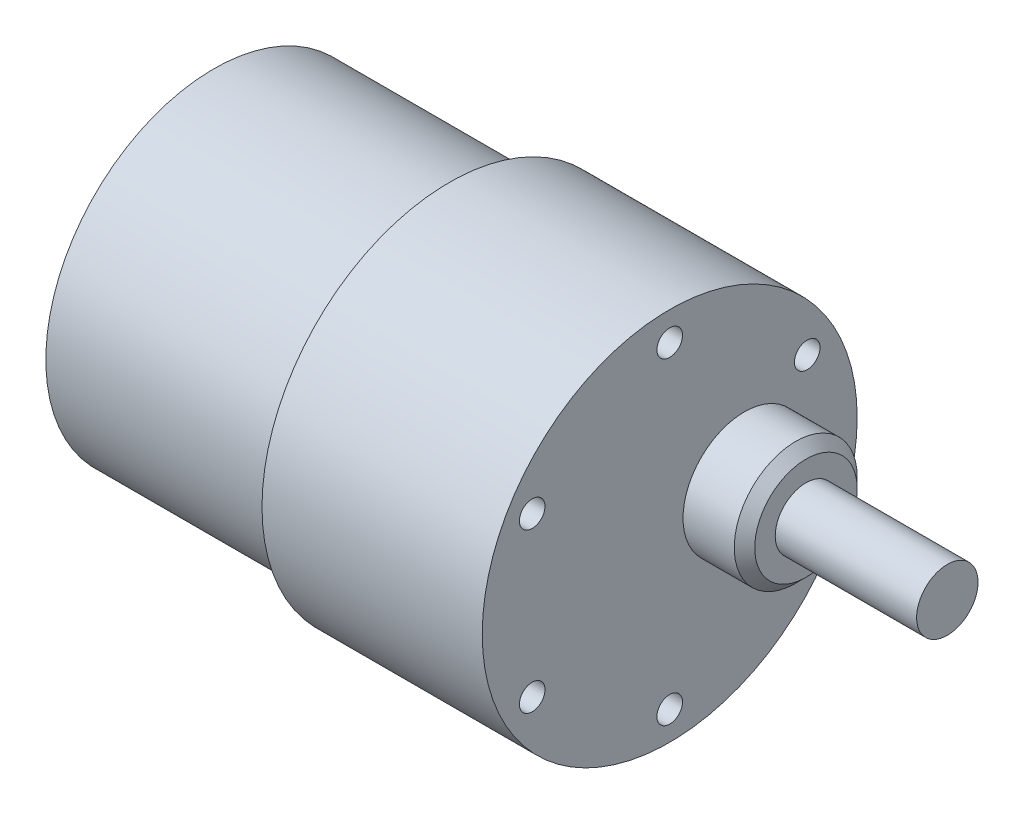
ISO-10303-21;
HEADER;
FILE_DESCRIPTION(('STEP AP214'),'2;1');
FILE_NAME('part.step','',(''),(''),'','','');
FILE_SCHEMA(('AUTOMOTIVE_DESIGN { 1 0 10303 214 1 1 1 1 }'));
ENDSEC;
DATA;
#1=APPLICATION_CONTEXT('core data for automotive mechanical design processes');
#2=APPLICATION_PROTOCOL_DEFINITION('international standard','automotive_design',2000,#1);
#3=PRODUCT_CONTEXT('',#1,'mechanical');
#4=PRODUCT('Part','Part','',(#3));
#5=PRODUCT_RELATED_PRODUCT_CATEGORY('part','',(#4));
#6=PRODUCT_DEFINITION_FORMATION('','',#4);
#7=PRODUCT_DEFINITION_CONTEXT('part definition',#1,'design');
#8=PRODUCT_DEFINITION('design','',#6,#7);
#9=PRODUCT_DEFINITION_SHAPE('','',#8);
#10=(LENGTH_UNIT() NAMED_UNIT(*) SI_UNIT(.MILLI.,.METRE.));
#11=(NAMED_UNIT(*) PLANE_ANGLE_UNIT() SI_UNIT($,.RADIAN.));
#12=(NAMED_UNIT(*) SI_UNIT($,.STERADIAN.) SOLID_ANGLE_UNIT());
#13=UNCERTAINTY_MEASURE_WITH_UNIT(LENGTH_MEASURE(1.E-05),#10,'distance_accuracy_value','');
#14=(GEOMETRIC_REPRESENTATION_CONTEXT(3) GLOBAL_UNCERTAINTY_ASSIGNED_CONTEXT((#13)) GLOBAL_UNIT_ASSIGNED_CONTEXT((#10,
#11,#12)) REPRESENTATION_CONTEXT('',''));
#15=CARTESIAN_POINT('',(0.,0.,0.));
#16=DIRECTION('',(0.,0.,1.));
#17=DIRECTION('',(1.,0.,0.));
#18=AXIS2_PLACEMENT_3D('',#15,#16,#17);
#19=CARTESIAN_POINT('',(23.,0.,0.));
#20=DIRECTION('',(-1.,0.,0.));
#21=DIRECTION('',(0.,0.,1.));
#22=AXIS2_PLACEMENT_3D('',#19,#20,#21);
#23=CYLINDRICAL_SURFACE('',#22,16.4);
#24=CARTESIAN_POINT('',(23.,0.,0.));
#25=DIRECTION('',(1.,0.,0.));
#26=DIRECTION('',(0.,0.,-1.));
#27=AXIS2_PLACEMENT_3D('',#24,#25,#26);
#28=CIRCLE('',#27,16.4);
#29=CARTESIAN_POINT('',(23.,0.,-16.4));
#30=VERTEX_POINT('',#29);
#31=EDGE_CURVE('E141',#30,#30,#28,.T.);
#32=ORIENTED_EDGE('',*,*,#31,.F.);
#33=EDGE_LOOP('',(#32));
#34=FACE_BOUND('',#33,.T.);
#35=CARTESIAN_POINT('',(0.,0.,0.));
#36=DIRECTION('',(1.,0.,0.));
#37=DIRECTION('',(0.,0.,-1.));
#38=AXIS2_PLACEMENT_3D('',#35,#36,#37);
#39=CIRCLE('',#38,16.4);
#40=CARTESIAN_POINT('',(0.,0.,-16.4));
#41=VERTEX_POINT('',#40);
#42=EDGE_CURVE('E150',#41,#41,#39,.T.);
#43=ORIENTED_EDGE('',*,*,#42,.T.);
#44=EDGE_LOOP('',(#43));
#45=FACE_BOUND('',#44,.T.);
#46=ADVANCED_FACE('F46',(#34,#45),#23,.T.);
#47=CARTESIAN_POINT('',(0.,0.,0.));
#48=DIRECTION('',(1.,0.,0.));
#49=DIRECTION('',(0.,0.,-1.));
#50=AXIS2_PLACEMENT_3D('',#47,#48,#49);
#51=PLANE('',#50);
#52=ORIENTED_EDGE('',*,*,#42,.F.);
#53=EDGE_LOOP('',(#52));
#54=FACE_BOUND('',#53,.T.);
#55=ADVANCED_FACE('F174',(#54),#51,.F.);
#56=CARTESIAN_POINT('',(44.5,0.,0.));
#57=DIRECTION('',(-1.,0.,0.));
#58=DIRECTION('',(0.,0.,1.));
#59=AXIS2_PLACEMENT_3D('',#56,#57,#58);
#60=CYLINDRICAL_SURFACE('',#59,18.3);
#61=CARTESIAN_POINT('',(44.5,0.,0.));
#62=DIRECTION('',(1.,0.,0.));
#63=DIRECTION('',(0.,0.,-1.));
#64=AXIS2_PLACEMENT_3D('',#61,#62,#63);
#65=CIRCLE('',#64,18.3);
#66=CARTESIAN_POINT('',(44.5,0.,-18.3));
#67=VERTEX_POINT('',#66);
#68=EDGE_CURVE('E146',#67,#67,#65,.T.);
#69=ORIENTED_EDGE('',*,*,#68,.F.);
#70=EDGE_LOOP('',(#69));
#71=FACE_BOUND('',#70,.T.);
#72=CARTESIAN_POINT('',(23.,0.,0.));
#73=DIRECTION('',(1.,0.,0.));
#74=DIRECTION('',(0.,0.,-1.));
#75=AXIS2_PLACEMENT_3D('',#72,#73,#74);
#76=CIRCLE('',#75,18.3);
#77=CARTESIAN_POINT('',(23.,0.,-18.3));
#78=VERTEX_POINT('',#77);
#79=EDGE_CURVE('E145',#78,#78,#76,.T.);
#80=ORIENTED_EDGE('',*,*,#79,.T.);
#81=EDGE_LOOP('',(#80));
#82=FACE_BOUND('',#81,.T.);
#83=ADVANCED_FACE('F179',(#71,#82),#60,.T.);
#84=CARTESIAN_POINT('',(44.5,0.,0.));
#85=DIRECTION('',(1.,0.,0.));
#86=DIRECTION('',(0.,0.,-1.));
#87=AXIS2_PLACEMENT_3D('',#84,#85,#86);
#88=PLANE('',#87);
#89=CARTESIAN_POINT('',(44.5,7.75000000000016,-13.4233937586587));
#90=DIRECTION('',(1.,0.,0.));
#91=DIRECTION('',(0.,0.,-1.));
#92=AXIS2_PLACEMENT_3D('',#89,#90,#91);
#93=CIRCLE('',#92,1.24999999999999);
#94=CARTESIAN_POINT('',(44.5,7.75000000000016,-14.6733937586587));
#95=VERTEX_POINT('',#94);
#96=EDGE_CURVE('E87',#95,#95,#93,.T.);
#97=ORIENTED_EDGE('',*,*,#96,.F.);
#98=EDGE_LOOP('',(#97));
#99=FACE_BOUND('',#98,.T.);
#100=CARTESIAN_POINT('',(44.5,-7.74999999999987,-13.4233937586589));
#101=DIRECTION('',(1.,0.,0.));
#102=DIRECTION('',(0.,0.,-1.));
#103=AXIS2_PLACEMENT_3D('',#100,#101,#102);
#104=CIRCLE('',#103,1.24999999999999);
#105=CARTESIAN_POINT('',(44.5,-7.74999999999987,-14.6733937586589));
#106=VERTEX_POINT('',#105);
#107=EDGE_CURVE('E86',#106,#106,#104,.T.);
#108=ORIENTED_EDGE('',*,*,#107,.F.);
#109=EDGE_LOOP('',(#108));
#110=FACE_BOUND('',#109,.T.);
#111=CARTESIAN_POINT('',(44.5,-15.5,0.));
#112=DIRECTION('',(1.,0.,0.));
#113=DIRECTION('',(0.,0.,-1.));
#114=AXIS2_PLACEMENT_3D('',#111,#112,#113);
#115=CIRCLE('',#114,1.24999999999999);
#116=CARTESIAN_POINT('',(44.5,-15.5,-1.24999999999999));
#117=VERTEX_POINT('',#116);
#118=EDGE_CURVE('E100',#117,#117,#115,.T.);
#119=ORIENTED_EDGE('',*,*,#118,.F.);
#120=EDGE_LOOP('',(#119));
#121=FACE_BOUND('',#120,.T.);
#122=CARTESIAN_POINT('',(44.5,-7.75000000000006,13.4233937586588));
#123=DIRECTION('',(1.,0.,0.));
#124=DIRECTION('',(0.,0.,-1.));
#125=AXIS2_PLACEMENT_3D('',#122,#123,#124);
#126=CIRCLE('',#125,1.24999999999999);
#127=CARTESIAN_POINT('',(44.5,-7.75000000000006,12.1733937586588));
#128=VERTEX_POINT('',#127);
#129=EDGE_CURVE('E108',#128,#128,#126,.T.);
#130=ORIENTED_EDGE('',*,*,#129,.F.);
#131=EDGE_LOOP('',(#130));
#132=FACE_BOUND('',#131,.T.);
#133=CARTESIAN_POINT('',(44.5,7.74999999999997,13.4233937586588));
#134=DIRECTION('',(1.,0.,0.));
#135=DIRECTION('',(0.,0.,-1.));
#136=AXIS2_PLACEMENT_3D('',#133,#134,#135);
#137=CIRCLE('',#136,1.24999999999999);
#138=CARTESIAN_POINT('',(44.5,7.74999999999997,12.1733937586588));
#139=VERTEX_POINT('',#138);
#140=EDGE_CURVE('E116',#139,#139,#137,.T.);
#141=ORIENTED_EDGE('',*,*,#140,.F.);
#142=EDGE_LOOP('',(#141));
#143=FACE_BOUND('',#142,.T.);
#144=CARTESIAN_POINT('',(44.5,15.5,0.));
#145=DIRECTION('',(1.,0.,0.));
#146=DIRECTION('',(0.,0.,-1.));
#147=AXIS2_PLACEMENT_3D('',#144,#145,#146);
#148=CIRCLE('',#147,1.24999999999999);
#149=CARTESIAN_POINT('',(44.5,15.5,-1.24999999999999));
#150=VERTEX_POINT('',#149);
#151=EDGE_CURVE('E124',#150,#150,#148,.T.);
#152=ORIENTED_EDGE('',*,*,#151,.F.);
#153=EDGE_LOOP('',(#152));
#154=FACE_BOUND('',#153,.T.);
#155=CARTESIAN_POINT('',(44.5,0.,-7.3));
#156=DIRECTION('',(1.,0.,0.));
#157=DIRECTION('',(0.,0.,-1.));
#158=AXIS2_PLACEMENT_3D('',#155,#156,#157);
#159=CIRCLE('',#158,6.);
#160=CARTESIAN_POINT('',(44.5,0.,-13.3));
#161=VERTEX_POINT('',#160);
#162=EDGE_CURVE('E136',#161,#161,#159,.T.);
#163=ORIENTED_EDGE('',*,*,#162,.F.);
#164=EDGE_LOOP('',(#163));
#165=FACE_BOUND('',#164,.T.);
#166=ORIENTED_EDGE('',*,*,#68,.T.);
#167=EDGE_LOOP('',(#166));
#168=FACE_BOUND('',#167,.T.);
#169=ADVANCED_FACE('F187',(#99,#110,#121,#132,#143,#154,#165,#168),#88,.T.);
#170=CARTESIAN_POINT('',(23.,0.,0.));
#171=DIRECTION('',(1.,0.,0.));
#172=DIRECTION('',(0.,0.,-1.));
#173=AXIS2_PLACEMENT_3D('',#170,#171,#172);
#174=PLANE('',#173);
#175=ORIENTED_EDGE('',*,*,#31,.T.);
#176=EDGE_LOOP('',(#175));
#177=FACE_BOUND('',#176,.T.);
#178=ORIENTED_EDGE('',*,*,#79,.F.);
#179=EDGE_LOOP('',(#178));
#180=FACE_BOUND('',#179,.T.);
#181=ADVANCED_FACE('F189',(#177,#180),#174,.F.);
#182=CARTESIAN_POINT('',(50.5,0.,-7.3));
#183=DIRECTION('',(-1.,0.,0.));
#184=DIRECTION('',(0.,0.,1.));
#185=AXIS2_PLACEMENT_3D('',#182,#183,#184);
#186=CYLINDRICAL_SURFACE('',#185,6.);
#187=CARTESIAN_POINT('',(49.5,0.,-7.3));
#188=DIRECTION('',(1.,0.,0.));
#189=DIRECTION('',(0.,0.,-1.));
#190=AXIS2_PLACEMENT_3D('',#187,#188,#189);
#191=CIRCLE('',#190,6.);
#192=CARTESIAN_POINT('',(49.5,0.,-13.3));
#193=VERTEX_POINT('',#192);
#194=EDGE_CURVE('E11',#193,#193,#191,.F.);
#195=ORIENTED_EDGE('',*,*,#194,.T.);
#196=EDGE_LOOP('',(#195));
#197=FACE_BOUND('',#196,.T.);
#198=ORIENTED_EDGE('',*,*,#162,.T.);
#199=EDGE_LOOP('',(#198));
#200=FACE_BOUND('',#199,.T.);
#201=ADVANCED_FACE('F192',(#197,#200),#186,.T.);
#202=CARTESIAN_POINT('',(50.5,0.,-7.3));
#203=DIRECTION('',(1.,0.,0.));
#204=DIRECTION('',(0.,0.,-1.));
#205=AXIS2_PLACEMENT_3D('',#202,#203,#204);
#206=PLANE('',#205);
#207=CARTESIAN_POINT('',(50.5,0.,-7.3));
#208=DIRECTION('',(1.,0.,0.));
#209=DIRECTION('',(0.,0.,-1.));
#210=AXIS2_PLACEMENT_3D('',#207,#208,#209);
#211=CIRCLE('',#210,4.99999999999999);
#212=CARTESIAN_POINT('',(50.5,0.,-12.3));
#213=VERTEX_POINT('',#212);
#214=EDGE_CURVE('E56',#213,#213,#211,.T.);
#215=ORIENTED_EDGE('',*,*,#214,.T.);
#216=EDGE_LOOP('',(#215));
#217=FACE_BOUND('',#216,.T.);
#218=CARTESIAN_POINT('',(50.5,0.,-7.3));
#219=DIRECTION('',(1.,0.,0.));
#220=DIRECTION('',(0.,0.,-1.));
#221=AXIS2_PLACEMENT_3D('',#218,#219,#220);
#222=CIRCLE('',#221,3.);
#223=CARTESIAN_POINT('',(50.5,0.,-4.3));
#224=VERTEX_POINT('',#223);
#225=EDGE_CURVE('E137',#224,#224,#222,.T.);
#226=ORIENTED_EDGE('',*,*,#225,.F.);
#227=EDGE_LOOP('',(#226));
#228=FACE_BOUND('',#227,.T.);
#229=ADVANCED_FACE('F163',(#217,#228),#206,.T.);
#230=CARTESIAN_POINT('',(64.3,0.,-7.3));
#231=DIRECTION('',(-1.,0.,0.));
#232=DIRECTION('',(0.,0.,1.));
#233=AXIS2_PLACEMENT_3D('',#230,#231,#232);
#234=CYLINDRICAL_SURFACE('',#233,3.);
#235=CARTESIAN_POINT('',(64.3,0.,-7.3));
#236=DIRECTION('',(1.,0.,0.));
#237=DIRECTION('',(0.,0.,-1.));
#238=AXIS2_PLACEMENT_3D('',#235,#236,#237);
#239=CIRCLE('',#238,3.);
#240=CARTESIAN_POINT('',(64.3,0.,-4.3));
#241=VERTEX_POINT('',#240);
#242=EDGE_CURVE('E132',#241,#241,#239,.T.);
#243=CARTESIAN_POINT('',(64.3,0.,-4.3));
#244=CARTESIAN_POINT('',(64.15625,0.,-4.3));
#245=CARTESIAN_POINT('',(64.0125,0.,-4.3));
#246=CARTESIAN_POINT('',(63.725,0.,-4.3));
#247=CARTESIAN_POINT('',(63.58125,0.,-4.3));
#248=CARTESIAN_POINT('',(63.29375,0.,-4.3));
#249=CARTESIAN_POINT('',(63.15,0.,-4.3));
#250=CARTESIAN_POINT('',(62.8625,0.,-4.3));
#251=CARTESIAN_POINT('',(62.71875,0.,-4.3));
#252=CARTESIAN_POINT('',(62.43125,0.,-4.3));
#253=CARTESIAN_POINT('',(62.2875,0.,-4.3));
#254=CARTESIAN_POINT('',(62.,0.,-4.3));
#255=CARTESIAN_POINT('',(61.85625,0.,-4.3));
#256=CARTESIAN_POINT('',(61.56875,0.,-4.3));
#257=CARTESIAN_POINT('',(61.425,0.,-4.3));
#258=CARTESIAN_POINT('',(61.1375,0.,-4.3));
#259=CARTESIAN_POINT('',(60.99375,0.,-4.3));
#260=CARTESIAN_POINT('',(60.70625,0.,-4.3));
#261=CARTESIAN_POINT('',(60.5625,0.,-4.3));
#262=CARTESIAN_POINT('',(60.275,0.,-4.3));
#263=CARTESIAN_POINT('',(60.13125,0.,-4.3));
#264=CARTESIAN_POINT('',(59.84375,0.,-4.3));
#265=CARTESIAN_POINT('',(59.7,0.,-4.3));
#266=CARTESIAN_POINT('',(59.4125,0.,-4.3));
#267=CARTESIAN_POINT('',(59.26875,0.,-4.3));
#268=CARTESIAN_POINT('',(58.98125,0.,-4.3));
#269=CARTESIAN_POINT('',(58.8375,0.,-4.3));
#270=CARTESIAN_POINT('',(58.55,0.,-4.3));
#271=CARTESIAN_POINT('',(58.40625,0.,-4.3));
#272=CARTESIAN_POINT('',(58.11875,0.,-4.3));
#273=CARTESIAN_POINT('',(57.975,0.,-4.3));
#274=CARTESIAN_POINT('',(57.6875,0.,-4.3));
#275=CARTESIAN_POINT('',(57.54375,0.,-4.3));
#276=CARTESIAN_POINT('',(57.25625,0.,-4.3));
#277=CARTESIAN_POINT('',(57.1125,0.,-4.3));
#278=CARTESIAN_POINT('',(56.825,0.,-4.3));
#279=CARTESIAN_POINT('',(56.68125,0.,-4.3));
#280=CARTESIAN_POINT('',(56.39375,0.,-4.3));
#281=CARTESIAN_POINT('',(56.25,0.,-4.3));
#282=CARTESIAN_POINT('',(55.9625,0.,-4.3));
#283=CARTESIAN_POINT('',(55.81875,0.,-4.3));
#284=CARTESIAN_POINT('',(55.53125,0.,-4.3));
#285=CARTESIAN_POINT('',(55.3875,0.,-4.3));
#286=CARTESIAN_POINT('',(55.1,0.,-4.3));
#287=CARTESIAN_POINT('',(54.95625,0.,-4.3));
#288=CARTESIAN_POINT('',(54.66875,0.,-4.3));
#289=CARTESIAN_POINT('',(54.525,0.,-4.3));
#290=CARTESIAN_POINT('',(54.2375,0.,-4.3));
#291=CARTESIAN_POINT('',(54.09375,0.,-4.3));
#292=CARTESIAN_POINT('',(53.80625,0.,-4.3));
#293=CARTESIAN_POINT('',(53.6625,0.,-4.3));
#294=CARTESIAN_POINT('',(53.375,0.,-4.3));
#295=CARTESIAN_POINT('',(53.23125,0.,-4.3));
#296=CARTESIAN_POINT('',(52.94375,0.,-4.3));
#297=CARTESIAN_POINT('',(52.8,0.,-4.3));
#298=CARTESIAN_POINT('',(52.5125,0.,-4.3));
#299=CARTESIAN_POINT('',(52.36875,0.,-4.3));
#300=CARTESIAN_POINT('',(52.08125,0.,-4.3));
#301=CARTESIAN_POINT('',(51.9375,0.,-4.3));
#302=CARTESIAN_POINT('',(51.65,0.,-4.3));
#303=CARTESIAN_POINT('',(51.50625,0.,-4.3));
#304=CARTESIAN_POINT('',(51.21875,0.,-4.3));
#305=CARTESIAN_POINT('',(51.075,0.,-4.3));
#306=CARTESIAN_POINT('',(50.7875,0.,-4.3));
#307=CARTESIAN_POINT('',(50.64375,0.,-4.3));
#308=CARTESIAN_POINT('',(50.5,0.,-4.3));
#309=B_SPLINE_CURVE_WITH_KNOTS('',3,(#243,#244,#245,#246,#247,#248,#249,#250,#251,#252,#253,
#254,#255,#256,#257,#258,#259,#260,#261,#262,#263,#264,#265,#266,#267,#268,#269,#270,#271,#272,
#273,#274,#275,#276,#277,#278,#279,#280,#281,#282,#283,#284,#285,#286,#287,#288,#289,#290,#291,
#292,#293,#294,#295,#296,#297,#298,#299,#300,#301,#302,#303,#304,#305,#306,#307,#308),
.UNSPECIFIED.,.F.,.F.,(4,2,2,2,2,2,2,2,2,2,2,2,2,2,2,2,2,2,2,2,2,2,2,2,2,2,2,2,2,2,2,2,4),(0.,
0.431249999999994,0.862499999999988,1.29375,1.72499999999999,2.15624999999999,2.58749999999999,
3.01874999999999,3.44999999999999,3.88124999999999,4.31249999999999,4.74374999999999,
5.17499999999999,5.60624999999999,6.03749999999999,6.46874999999999,6.89999999999999,
7.33124999999999,7.76249999999999,8.19374999999999,8.62499999999999,9.05624999999999,
9.48749999999999,9.91874999999999,10.35,10.78125,11.2125,11.64375,12.075,12.50625,12.9375,
13.36875,13.8),.UNSPECIFIED.);
#310=EDGE_CURVE('BSEAM202',#241,#224,#309,.T.);
#311=ORIENTED_EDGE('',*,*,#242,.F.);
#312=ORIENTED_EDGE('',*,*,#225,.T.);
#313=ORIENTED_EDGE('',*,*,#310,.T.);
#314=ORIENTED_EDGE('',*,*,#310,.F.);
#315=EDGE_LOOP('',(#311,#313,#312,#314));
#316=FACE_BOUND('',#315,.T.);
#317=ADVANCED_FACE('F202',(#316),#234,.T.);
#318=CARTESIAN_POINT('',(64.3,0.,-7.3));
#319=DIRECTION('',(1.,0.,0.));
#320=DIRECTION('',(0.,0.,-1.));
#321=AXIS2_PLACEMENT_3D('',#318,#319,#320);
#322=PLANE('',#321);
#323=ORIENTED_EDGE('',*,*,#242,.T.);
#324=EDGE_LOOP('',(#323));
#325=FACE_BOUND('',#324,.T.);
#326=ADVANCED_FACE('F205',(#325),#322,.T.);
#327=CARTESIAN_POINT('',(39.5,15.5,0.));
#328=DIRECTION('',(1.,0.,0.));
#329=DIRECTION('',(0.,0.,-1.));
#330=AXIS2_PLACEMENT_3D('',#327,#328,#329);
#331=CONICAL_SURFACE('',#330,1.25,1.02974425867665);
#332=CARTESIAN_POINT('',(38.7489242262155,15.5,0.));
#333=VERTEX_POINT('',#332);
#334=VERTEX_LOOP('',#333);
#335=FACE_BOUND('',#334,.T.);
#336=CARTESIAN_POINT('',(39.5,15.5,0.));
#337=DIRECTION('',(1.,0.,0.));
#338=DIRECTION('',(0.,0.,-1.));
#339=AXIS2_PLACEMENT_3D('',#336,#337,#338);
#340=CIRCLE('',#339,1.25);
#341=CARTESIAN_POINT('',(39.5,15.5,-1.25));
#342=VERTEX_POINT('',#341);
#343=EDGE_CURVE('E128',#342,#342,#340,.T.);
#344=ORIENTED_EDGE('',*,*,#343,.T.);
#345=EDGE_LOOP('',(#344));
#346=FACE_BOUND('',#345,.T.);
#347=ADVANCED_FACE('F209',(#335,#346),#331,.F.);
#348=CARTESIAN_POINT('',(44.5,15.5,0.));
#349=DIRECTION('',(1.,0.,0.));
#350=DIRECTION('',(0.,0.,-1.));
#351=AXIS2_PLACEMENT_3D('',#348,#349,#350);
#352=CYLINDRICAL_SURFACE('',#351,1.24999999999999);
#353=ORIENTED_EDGE('',*,*,#343,.F.);
#354=EDGE_LOOP('',(#353));
#355=FACE_BOUND('',#354,.T.);
#356=ORIENTED_EDGE('',*,*,#151,.T.);
#357=EDGE_LOOP('',(#356));
#358=FACE_BOUND('',#357,.T.);
#359=ADVANCED_FACE('F213',(#355,#358),#352,.F.);
#360=CARTESIAN_POINT('',(39.5,7.74999999999997,13.4233937586588));
#361=DIRECTION('',(1.,0.,0.));
#362=DIRECTION('',(0.,0.,-1.));
#363=AXIS2_PLACEMENT_3D('',#360,#361,#362);
#364=CONICAL_SURFACE('',#363,1.25,1.02974425867665);
#365=CARTESIAN_POINT('',(38.7489242262155,7.74999999999997,13.4233937586588));
#366=VERTEX_POINT('',#365);
#367=VERTEX_LOOP('',#366);
#368=FACE_BOUND('',#367,.T.);
#369=CARTESIAN_POINT('',(39.5,7.74999999999997,13.4233937586588));
#370=DIRECTION('',(1.,0.,0.));
#371=DIRECTION('',(0.,0.,-1.));
#372=AXIS2_PLACEMENT_3D('',#369,#370,#371);
#373=CIRCLE('',#372,1.25);
#374=CARTESIAN_POINT('',(39.5,7.74999999999997,12.1733937586588));
#375=VERTEX_POINT('',#374);
#376=EDGE_CURVE('E120',#375,#375,#373,.T.);
#377=ORIENTED_EDGE('',*,*,#376,.T.);
#378=EDGE_LOOP('',(#377));
#379=FACE_BOUND('',#378,.T.);
#380=ADVANCED_FACE('F216',(#368,#379),#364,.F.);
#381=CARTESIAN_POINT('',(44.5,7.74999999999997,13.4233937586588));
#382=DIRECTION('',(1.,0.,0.));
#383=DIRECTION('',(0.,0.,-1.));
#384=AXIS2_PLACEMENT_3D('',#381,#382,#383);
#385=CYLINDRICAL_SURFACE('',#384,1.24999999999999);
#386=ORIENTED_EDGE('',*,*,#376,.F.);
#387=EDGE_LOOP('',(#386));
#388=FACE_BOUND('',#387,.T.);
#389=ORIENTED_EDGE('',*,*,#140,.T.);
#390=EDGE_LOOP('',(#389));
#391=FACE_BOUND('',#390,.T.);
#392=ADVANCED_FACE('F220',(#388,#391),#385,.F.);
#393=CARTESIAN_POINT('',(39.5,-7.75000000000006,13.4233937586588));
#394=DIRECTION('',(1.,0.,0.));
#395=DIRECTION('',(0.,0.,-1.));
#396=AXIS2_PLACEMENT_3D('',#393,#394,#395);
#397=CONICAL_SURFACE('',#396,1.25,1.02974425867665);
#398=CARTESIAN_POINT('',(38.7489242262155,-7.75000000000006,13.4233937586588));
#399=VERTEX_POINT('',#398);
#400=VERTEX_LOOP('',#399);
#401=FACE_BOUND('',#400,.T.);
#402=CARTESIAN_POINT('',(39.5,-7.75000000000006,13.4233937586588));
#403=DIRECTION('',(1.,0.,0.));
#404=DIRECTION('',(0.,0.,-1.));
#405=AXIS2_PLACEMENT_3D('',#402,#403,#404);
#406=CIRCLE('',#405,1.25);
#407=CARTESIAN_POINT('',(39.5,-7.75000000000006,12.1733937586588));
#408=VERTEX_POINT('',#407);
#409=EDGE_CURVE('E112',#408,#408,#406,.T.);
#410=ORIENTED_EDGE('',*,*,#409,.T.);
#411=EDGE_LOOP('',(#410));
#412=FACE_BOUND('',#411,.T.);
#413=ADVANCED_FACE('F223',(#401,#412),#397,.F.);
#414=CARTESIAN_POINT('',(44.5,-7.75000000000006,13.4233937586588));
#415=DIRECTION('',(1.,0.,0.));
#416=DIRECTION('',(0.,0.,-1.));
#417=AXIS2_PLACEMENT_3D('',#414,#415,#416);
#418=CYLINDRICAL_SURFACE('',#417,1.24999999999999);
#419=ORIENTED_EDGE('',*,*,#409,.F.);
#420=EDGE_LOOP('',(#419));
#421=FACE_BOUND('',#420,.T.);
#422=ORIENTED_EDGE('',*,*,#129,.T.);
#423=EDGE_LOOP('',(#422));
#424=FACE_BOUND('',#423,.T.);
#425=ADVANCED_FACE('F227',(#421,#424),#418,.F.);
#426=CARTESIAN_POINT('',(39.5,-15.5,0.));
#427=DIRECTION('',(1.,0.,0.));
#428=DIRECTION('',(0.,0.,-1.));
#429=AXIS2_PLACEMENT_3D('',#426,#427,#428);
#430=CONICAL_SURFACE('',#429,1.25,1.02974425867665);
#431=CARTESIAN_POINT('',(38.7489242262155,-15.5,0.));
#432=VERTEX_POINT('',#431);
#433=VERTEX_LOOP('',#432);
#434=FACE_BOUND('',#433,.T.);
#435=CARTESIAN_POINT('',(39.5,-15.5,0.));
#436=DIRECTION('',(1.,0.,0.));
#437=DIRECTION('',(0.,0.,-1.));
#438=AXIS2_PLACEMENT_3D('',#435,#436,#437);
#439=CIRCLE('',#438,1.25);
#440=CARTESIAN_POINT('',(39.5,-15.5,-1.25));
#441=VERTEX_POINT('',#440);
#442=EDGE_CURVE('E104',#441,#441,#439,.T.);
#443=ORIENTED_EDGE('',*,*,#442,.T.);
#444=EDGE_LOOP('',(#443));
#445=FACE_BOUND('',#444,.T.);
#446=ADVANCED_FACE('F231',(#434,#445),#430,.F.);
#447=CARTESIAN_POINT('',(44.5,-15.5,0.));
#448=DIRECTION('',(1.,0.,0.));
#449=DIRECTION('',(0.,0.,-1.));
#450=AXIS2_PLACEMENT_3D('',#447,#448,#449);
#451=CYLINDRICAL_SURFACE('',#450,1.24999999999999);
#452=ORIENTED_EDGE('',*,*,#442,.F.);
#453=EDGE_LOOP('',(#452));
#454=FACE_BOUND('',#453,.T.);
#455=ORIENTED_EDGE('',*,*,#118,.T.);
#456=EDGE_LOOP('',(#455));
#457=FACE_BOUND('',#456,.T.);
#458=ADVANCED_FACE('F235',(#454,#457),#451,.F.);
#459=CARTESIAN_POINT('',(39.5,-7.74999999999987,-13.4233937586589));
#460=DIRECTION('',(1.,0.,0.));
#461=DIRECTION('',(0.,0.,-1.));
#462=AXIS2_PLACEMENT_3D('',#459,#460,#461);
#463=CONICAL_SURFACE('',#462,1.25,1.02974425867665);
#464=CARTESIAN_POINT('',(38.7489242262155,-7.74999999999988,-13.4233937586589));
#465=VERTEX_POINT('',#464);
#466=VERTEX_LOOP('',#465);
#467=FACE_BOUND('',#466,.T.);
#468=CARTESIAN_POINT('',(39.5,-7.74999999999987,-13.4233937586589));
#469=DIRECTION('',(1.,0.,0.));
#470=DIRECTION('',(0.,0.,-1.));
#471=AXIS2_PLACEMENT_3D('',#468,#469,#470);
#472=CIRCLE('',#471,1.25);
#473=CARTESIAN_POINT('',(39.5,-7.74999999999987,-14.6733937586589));
#474=VERTEX_POINT('',#473);
#475=EDGE_CURVE('E92',#474,#474,#472,.T.);
#476=ORIENTED_EDGE('',*,*,#475,.T.);
#477=EDGE_LOOP('',(#476));
#478=FACE_BOUND('',#477,.T.);
#479=ADVANCED_FACE('F239',(#467,#478),#463,.F.);
#480=CARTESIAN_POINT('',(44.5,-7.74999999999987,-13.4233937586589));
#481=DIRECTION('',(1.,0.,0.));
#482=DIRECTION('',(0.,0.,-1.));
#483=AXIS2_PLACEMENT_3D('',#480,#481,#482);
#484=CYLINDRICAL_SURFACE('',#483,1.24999999999999);
#485=ORIENTED_EDGE('',*,*,#475,.F.);
#486=EDGE_LOOP('',(#485));
#487=FACE_BOUND('',#486,.T.);
#488=ORIENTED_EDGE('',*,*,#107,.T.);
#489=EDGE_LOOP('',(#488));
#490=FACE_BOUND('',#489,.T.);
#491=ADVANCED_FACE('F79',(#487,#490),#484,.F.);
#492=CARTESIAN_POINT('',(39.5,7.75000000000016,-13.4233937586587));
#493=DIRECTION('',(1.,0.,0.));
#494=DIRECTION('',(0.,0.,-1.));
#495=AXIS2_PLACEMENT_3D('',#492,#493,#494);
#496=CONICAL_SURFACE('',#495,1.25,1.02974425867665);
#497=CARTESIAN_POINT('',(38.7489242262155,7.75000000000016,-13.4233937586587));
#498=VERTEX_POINT('',#497);
#499=VERTEX_LOOP('',#498);
#500=FACE_BOUND('',#499,.T.);
#501=CARTESIAN_POINT('',(39.5,7.75000000000016,-13.4233937586587));
#502=DIRECTION('',(1.,0.,0.));
#503=DIRECTION('',(0.,0.,-1.));
#504=AXIS2_PLACEMENT_3D('',#501,#502,#503);
#505=CIRCLE('',#504,1.25);
#506=CARTESIAN_POINT('',(39.5,7.75000000000016,-14.6733937586587));
#507=VERTEX_POINT('',#506);
#508=EDGE_CURVE('E83',#507,#507,#505,.T.);
#509=ORIENTED_EDGE('',*,*,#508,.T.);
#510=EDGE_LOOP('',(#509));
#511=FACE_BOUND('',#510,.T.);
#512=ADVANCED_FACE('F75',(#500,#511),#496,.F.);
#513=CARTESIAN_POINT('',(44.5,7.75000000000016,-13.4233937586587));
#514=DIRECTION('',(1.,0.,0.));
#515=DIRECTION('',(0.,0.,-1.));
#516=AXIS2_PLACEMENT_3D('',#513,#514,#515);
#517=CYLINDRICAL_SURFACE('',#516,1.24999999999999);
#518=ORIENTED_EDGE('',*,*,#508,.F.);
#519=EDGE_LOOP('',(#518));
#520=FACE_BOUND('',#519,.T.);
#521=ORIENTED_EDGE('',*,*,#96,.T.);
#522=EDGE_LOOP('',(#521));
#523=FACE_BOUND('',#522,.T.);
#524=ADVANCED_FACE('F78',(#520,#523),#517,.F.);
#525=CARTESIAN_POINT('',(50.5,0.,-7.3));
#526=DIRECTION('',(-1.,0.,0.));
#527=DIRECTION('',(0.,0.,1.));
#528=AXIS2_PLACEMENT_3D('',#525,#526,#527);
#529=CONICAL_SURFACE('',#528,4.99999999999999,0.785398163397449);
#530=ORIENTED_EDGE('',*,*,#194,.F.);
#531=EDGE_LOOP('',(#530));
#532=FACE_BOUND('',#531,.T.);
#533=ORIENTED_EDGE('',*,*,#214,.F.);
#534=EDGE_LOOP('',(#533));
#535=FACE_BOUND('',#534,.T.);
#536=ADVANCED_FACE('F49',(#532,#535),#529,.T.);
#537=CLOSED_SHELL('',(#46,#55,#83,#169,#181,#201,#229,#317,#326,#347,#359,#380,#392,#413,#425,
#446,#458,#479,#491,#512,#524,#536));
#538=MANIFOLD_SOLID_BREP('B2',#537);
#539=ADVANCED_BREP_SHAPE_REPRESENTATION('',(#18,#538),#14);
#540=SHAPE_DEFINITION_REPRESENTATION(#9,#539);
ENDSEC;
END-ISO-10303-21;
